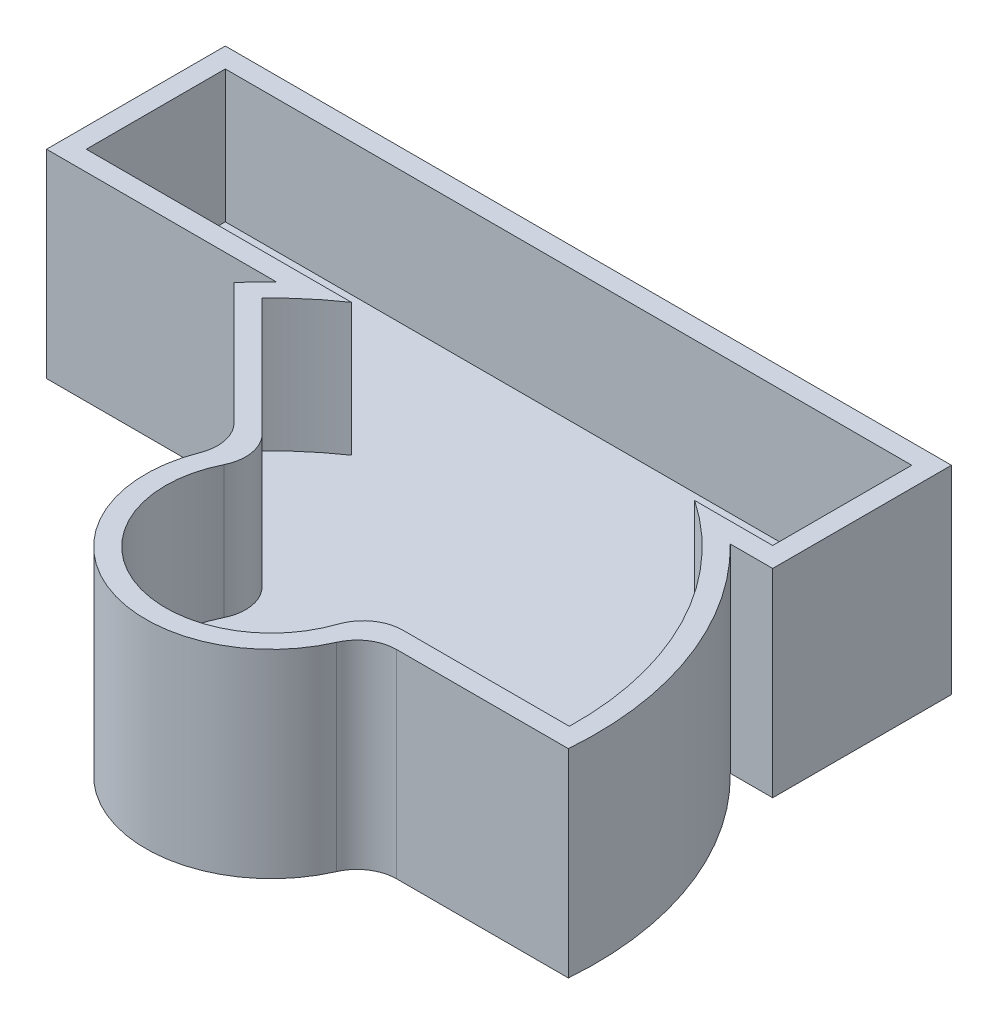
ISO-10303-21;
HEADER;
FILE_DESCRIPTION(('STEP AP214'),'2;1');
FILE_NAME('part.step','',(''),(''),'','','');
FILE_SCHEMA(('AUTOMOTIVE_DESIGN { 1 0 10303 214 1 1 1 1 }'));
ENDSEC;
DATA;
#1=APPLICATION_CONTEXT('core data for automotive mechanical design processes');
#2=APPLICATION_PROTOCOL_DEFINITION('international standard','automotive_design',2000,#1);
#3=PRODUCT_CONTEXT('',#1,'mechanical');
#4=PRODUCT('Part','Part','',(#3));
#5=PRODUCT_RELATED_PRODUCT_CATEGORY('part','',(#4));
#6=PRODUCT_DEFINITION_FORMATION('','',#4);
#7=PRODUCT_DEFINITION_CONTEXT('part definition',#1,'design');
#8=PRODUCT_DEFINITION('design','',#6,#7);
#9=PRODUCT_DEFINITION_SHAPE('','',#8);
#10=(LENGTH_UNIT() NAMED_UNIT(*) SI_UNIT(.MILLI.,.METRE.));
#11=(NAMED_UNIT(*) PLANE_ANGLE_UNIT() SI_UNIT($,.RADIAN.));
#12=(NAMED_UNIT(*) SI_UNIT($,.STERADIAN.) SOLID_ANGLE_UNIT());
#13=UNCERTAINTY_MEASURE_WITH_UNIT(LENGTH_MEASURE(1.E-05),#10,'distance_accuracy_value','');
#14=(GEOMETRIC_REPRESENTATION_CONTEXT(3) GLOBAL_UNCERTAINTY_ASSIGNED_CONTEXT((#13)) GLOBAL_UNIT_ASSIGNED_CONTEXT((#10,
#11,#12)) REPRESENTATION_CONTEXT('',''));
#15=CARTESIAN_POINT('',(0.,0.,0.));
#16=DIRECTION('',(0.,0.,1.));
#17=DIRECTION('',(1.,0.,0.));
#18=AXIS2_PLACEMENT_3D('',#15,#16,#17);
#19=CARTESIAN_POINT('',(-35.,0.,32.5));
#20=DIRECTION('',(0.,1.,0.));
#21=DIRECTION('',(0.,0.,1.));
#22=AXIS2_PLACEMENT_3D('',#19,#20,#21);
#23=PLANE('',#22);
#24=CARTESIAN_POINT('',(0.,0.,17.5));
#25=DIRECTION('',(0.,1.,0.));
#26=DIRECTION('',(0.,0.,1.));
#27=AXIS2_PLACEMENT_3D('',#24,#25,#26);
#28=CIRCLE('',#27,4.);
#29=CARTESIAN_POINT('',(0.,0.,21.5));
#30=VERTEX_POINT('',#29);
#31=EDGE_CURVE('E387',#30,#30,#28,.T.);
#32=ORIENTED_EDGE('',*,*,#31,.T.);
#33=EDGE_LOOP('',(#32));
#34=FACE_BOUND('',#33,.T.);
#35=CARTESIAN_POINT('',(0.,0.,17.5));
#36=DIRECTION('',(0.,1.,0.));
#37=DIRECTION('',(0.,0.,1.));
#38=AXIS2_PLACEMENT_3D('',#35,#36,#37);
#39=CIRCLE('',#38,24.5);
#40=CARTESIAN_POINT('',(-17.1464281994822,0.,0.));
#41=VERTEX_POINT('',#40);
#42=CARTESIAN_POINT('',(-18.6805102122051,0.,1.64791691254111));
#43=VERTEX_POINT('',#42);
#44=EDGE_CURVE('E237',#41,#43,#39,.T.);
#45=ORIENTED_EDGE('',*,*,#44,.F.);
#46=DIRECTION('',(1.,0.,0.));
#47=VECTOR('',#46,1.);
#48=CARTESIAN_POINT('',(-35.,0.,0.));
#49=LINE('',#48,#47);
#50=CARTESIAN_POINT('',(-34.4868,0.,0.));
#51=VERTEX_POINT('',#50);
#52=EDGE_CURVE('E234',#51,#41,#49,.T.);
#53=ORIENTED_EDGE('',*,*,#52,.F.);
#54=DIRECTION('',(0.,0.,1.));
#55=VECTOR('',#54,1.);
#56=CARTESIAN_POINT('',(-34.4868,0.,32.5));
#57=LINE('',#56,#55);
#58=CARTESIAN_POINT('',(-34.4868,0.,-13.5));
#59=VERTEX_POINT('',#58);
#60=EDGE_CURVE('E231',#59,#51,#57,.T.);
#61=ORIENTED_EDGE('',*,*,#60,.F.);
#62=DIRECTION('',(-1.,0.,0.));
#63=VECTOR('',#62,1.);
#64=CARTESIAN_POINT('',(-35.,0.,-13.5));
#65=LINE('',#64,#63);
#66=CARTESIAN_POINT('',(20.3496,0.,-13.5));
#67=VERTEX_POINT('',#66);
#68=EDGE_CURVE('E228',#67,#59,#65,.T.);
#69=ORIENTED_EDGE('',*,*,#68,.F.);
#70=DIRECTION('',(0.,0.,-1.));
#71=VECTOR('',#70,1.);
#72=CARTESIAN_POINT('',(20.3496,0.,32.5));
#73=LINE('',#72,#71);
#74=CARTESIAN_POINT('',(20.3496,0.,0.));
#75=VERTEX_POINT('',#74);
#76=EDGE_CURVE('E222',#75,#67,#73,.T.);
#77=ORIENTED_EDGE('',*,*,#76,.F.);
#78=DIRECTION('',(1.,0.,0.));
#79=VECTOR('',#78,1.);
#80=CARTESIAN_POINT('',(-35.,0.,0.));
#81=LINE('',#80,#79);
#82=CARTESIAN_POINT('',(17.1464281994822,0.,0.));
#83=VERTEX_POINT('',#82);
#84=EDGE_CURVE('E220',#83,#75,#81,.T.);
#85=ORIENTED_EDGE('',*,*,#84,.F.);
#86=CARTESIAN_POINT('',(0.,0.,17.5));
#87=DIRECTION('',(0.,1.,0.));
#88=DIRECTION('',(0.,0.,1.));
#89=AXIS2_PLACEMENT_3D('',#86,#87,#88);
#90=CIRCLE('',#89,24.5);
#91=CARTESIAN_POINT('',(24.4182308941496,0.,19.5));
#92=VERTEX_POINT('',#91);
#93=EDGE_CURVE('E205',#92,#83,#90,.T.);
#94=ORIENTED_EDGE('',*,*,#93,.F.);
#95=DIRECTION('',(1.,0.,0.));
#96=VECTOR('',#95,1.);
#97=CARTESIAN_POINT('',(-35.,0.,19.5));
#98=LINE('',#97,#96);
#99=CARTESIAN_POINT('',(11.4564392373896,0.,19.5));
#100=VERTEX_POINT('',#99);
#101=EDGE_CURVE('E195',#100,#92,#98,.T.);
#102=ORIENTED_EDGE('',*,*,#101,.F.);
#103=CARTESIAN_POINT('',(11.4564392373896,0.,22.5));
#104=DIRECTION('',(0.,1.,0.));
#105=DIRECTION('',(0.,0.,1.));
#106=AXIS2_PLACEMENT_3D('',#103,#104,#105);
#107=CIRCLE('',#106,3.);
#108=CARTESIAN_POINT('',(8.7068938204161,0.,21.3));
#109=VERTEX_POINT('',#108);
#110=EDGE_CURVE('E260',#100,#109,#107,.T.);
#111=ORIENTED_EDGE('',*,*,#110,.T.);
#112=CARTESIAN_POINT('',(0.,0.,17.5));
#113=DIRECTION('',(0.,1.,0.));
#114=DIRECTION('',(0.,0.,1.));
#115=AXIS2_PLACEMENT_3D('',#112,#113,#114);
#116=CIRCLE('',#115,9.5);
#117=CARTESIAN_POINT('',(-8.84370943199635,0.,14.0303021050214));
#118=VERTEX_POINT('',#117);
#119=EDGE_CURVE('E206',#118,#109,#116,.T.);
#120=ORIENTED_EDGE('',*,*,#119,.F.);
#121=CARTESIAN_POINT('',(-11.6364597789426,0.,12.9346080329229));
#122=DIRECTION('',(0.,1.,0.));
#123=DIRECTION('',(0.,0.,1.));
#124=AXIS2_PLACEMENT_3D('',#121,#122,#123);
#125=CIRCLE('',#124,3.);
#126=CARTESIAN_POINT('',(-9.51513943538292,0.,10.8132876893633));
#127=VERTEX_POINT('',#126);
#128=EDGE_CURVE('E264',#118,#127,#125,.T.);
#129=ORIENTED_EDGE('',*,*,#128,.T.);
#130=DIRECTION('',(0.707106781186548,0.,0.707106781186547));
#131=VECTOR('',#130,1.);
#132=CARTESIAN_POINT('',(-11.4142135623731,0.,8.9142135623731));
#133=LINE('',#132,#131);
#134=EDGE_CURVE('E390',#43,#127,#133,.T.);
#135=ORIENTED_EDGE('',*,*,#134,.F.);
#136=EDGE_LOOP('',(#45,#53,#61,#69,#77,#85,#94,#102,#111,#120,#129,#135));
#137=FACE_BOUND('',#136,.T.);
#138=ADVANCED_FACE('F32',(#34,#137),#23,.F.);
#139=CARTESIAN_POINT('',(-35.,5.,32.5));
#140=DIRECTION('',(0.,1.,0.));
#141=DIRECTION('',(0.,0.,1.));
#142=AXIS2_PLACEMENT_3D('',#139,#140,#141);
#143=PLANE('',#142);
#144=DIRECTION('',(0.,0.,1.));
#145=VECTOR('',#144,1.);
#146=CARTESIAN_POINT('',(-32.9868,5.,-12.));
#147=LINE('',#146,#145);
#148=CARTESIAN_POINT('',(-32.9868,5.,-12.));
#149=VERTEX_POINT('',#148);
#150=CARTESIAN_POINT('',(-32.9868,5.,-1.49999999999999));
#151=VERTEX_POINT('',#150);
#152=EDGE_CURVE('E313',#149,#151,#147,.T.);
#153=ORIENTED_EDGE('',*,*,#152,.T.);
#154=DIRECTION('',(1.,0.,0.));
#155=VECTOR('',#154,1.);
#156=CARTESIAN_POINT('',(-32.9868,5.,-1.49999999999999));
#157=LINE('',#156,#155);
#158=CARTESIAN_POINT('',(-12.9614813968157,5.,-1.49999999999999));
#159=VERTEX_POINT('',#158);
#160=EDGE_CURVE('E315',#151,#159,#157,.T.);
#161=ORIENTED_EDGE('',*,*,#160,.T.);
#162=CARTESIAN_POINT('',(0.,5.,17.5));
#163=DIRECTION('',(0.,1.,0.));
#164=DIRECTION('',(0.,0.,1.));
#165=AXIS2_PLACEMENT_3D('',#162,#163,#164);
#166=CIRCLE('',#165,23.);
#167=CARTESIAN_POINT('',(-16.6131659321024,5.,1.5939408490842));
#168=VERTEX_POINT('',#167);
#169=EDGE_CURVE('E317',#159,#168,#166,.T.);
#170=ORIENTED_EDGE('',*,*,#169,.T.);
#171=DIRECTION('',(0.707106781186547,0.,0.707106781186548));
#172=VECTOR('',#171,1.);
#173=CARTESIAN_POINT('',(-5.99934828591139,5.,12.2077584952752));
#174=LINE('',#173,#172);
#175=CARTESIAN_POINT('',(-7.72749399246959,5.,10.479612788717));
#176=VERTEX_POINT('',#175);
#177=EDGE_CURVE('E319',#168,#176,#174,.T.);
#178=ORIENTED_EDGE('',*,*,#177,.T.);
#179=CARTESIAN_POINT('',(-9.84881433602923,5.,12.6009331322766));
#180=DIRECTION('',(0.,1.,0.));
#181=DIRECTION('',(0.,0.,1.));
#182=AXIS2_PLACEMENT_3D('',#179,#180,#181);
#183=CIRCLE('',#182,3.);
#184=CARTESIAN_POINT('',(-7.16277406256671,5.,13.9370422780194));
#185=VERTEX_POINT('',#184);
#186=EDGE_CURVE('E12',#176,#185,#183,.F.);
#187=ORIENTED_EDGE('',*,*,#186,.T.);
#188=CARTESIAN_POINT('',(0.,5.,17.5));
#189=DIRECTION('',(0.,1.,0.));
#190=DIRECTION('',(0.,0.,1.));
#191=AXIS2_PLACEMENT_3D('',#188,#189,#190);
#192=CIRCLE('',#191,8.);
#193=CARTESIAN_POINT('',(7.58423767804153,5.,20.0454545454546));
#194=VERTEX_POINT('',#193);
#195=EDGE_CURVE('E275',#185,#194,#192,.T.);
#196=ORIENTED_EDGE('',*,*,#195,.T.);
#197=CARTESIAN_POINT('',(10.4283268073071,5.,21.));
#198=DIRECTION('',(0.,1.,0.));
#199=DIRECTION('',(0.,0.,1.));
#200=AXIS2_PLACEMENT_3D('',#197,#198,#199);
#201=CIRCLE('',#200,3.);
#202=CARTESIAN_POINT('',(10.4283268073071,5.,18.));
#203=VERTEX_POINT('',#202);
#204=EDGE_CURVE('E40',#194,#203,#201,.F.);
#205=ORIENTED_EDGE('',*,*,#204,.T.);
#206=DIRECTION('',(1.,0.,0.));
#207=VECTOR('',#206,1.);
#208=CARTESIAN_POINT('',(7.98435971133566,5.,18.));
#209=LINE('',#208,#207);
#210=CARTESIAN_POINT('',(22.9945645751338,5.,18.));
#211=VERTEX_POINT('',#210);
#212=EDGE_CURVE('E272',#203,#211,#209,.T.);
#213=ORIENTED_EDGE('',*,*,#212,.T.);
#214=CARTESIAN_POINT('',(0.,5.,17.5));
#215=DIRECTION('',(0.,1.,0.));
#216=DIRECTION('',(0.,0.,1.));
#217=AXIS2_PLACEMENT_3D('',#214,#215,#216);
#218=CIRCLE('',#217,23.);
#219=CARTESIAN_POINT('',(12.9614813968157,5.,-1.49999999999999));
#220=VERTEX_POINT('',#219);
#221=EDGE_CURVE('E285',#211,#220,#218,.T.);
#222=ORIENTED_EDGE('',*,*,#221,.T.);
#223=DIRECTION('',(1.,0.,0.));
#224=VECTOR('',#223,1.);
#225=CARTESIAN_POINT('',(12.9614813968157,5.,-1.49999999999999));
#226=LINE('',#225,#224);
#227=CARTESIAN_POINT('',(18.8496,5.,-1.49999999999999));
#228=VERTEX_POINT('',#227);
#229=EDGE_CURVE('E324',#220,#228,#226,.T.);
#230=ORIENTED_EDGE('',*,*,#229,.T.);
#231=DIRECTION('',(0.,0.,-1.));
#232=VECTOR('',#231,1.);
#233=CARTESIAN_POINT('',(18.8496,5.,-12.));
#234=LINE('',#233,#232);
#235=CARTESIAN_POINT('',(18.8496,5.,-12.));
#236=VERTEX_POINT('',#235);
#237=EDGE_CURVE('E326',#228,#236,#234,.T.);
#238=ORIENTED_EDGE('',*,*,#237,.T.);
#239=DIRECTION('',(-1.,0.,0.));
#240=VECTOR('',#239,1.);
#241=CARTESIAN_POINT('',(-32.9868,5.,-12.));
#242=LINE('',#241,#240);
#243=EDGE_CURVE('E328',#236,#149,#242,.T.);
#244=ORIENTED_EDGE('',*,*,#243,.T.);
#245=EDGE_LOOP('',(#153,#161,#170,#178,#187,#196,#205,#213,#222,#230,#238,#244));
#246=FACE_BOUND('',#245,.T.);
#247=CARTESIAN_POINT('',(0.,5.,17.5));
#248=DIRECTION('',(0.,1.,0.));
#249=DIRECTION('',(0.,0.,1.));
#250=AXIS2_PLACEMENT_3D('',#247,#248,#249);
#251=CIRCLE('',#250,4.);
#252=CARTESIAN_POINT('',(0.,5.,21.5));
#253=VERTEX_POINT('',#252);
#254=EDGE_CURVE('E386',#253,#253,#251,.T.);
#255=ORIENTED_EDGE('',*,*,#254,.F.);
#256=EDGE_LOOP('',(#255));
#257=FACE_BOUND('',#256,.T.);
#258=ADVANCED_FACE('F270',(#246,#257),#143,.T.);
#259=CARTESIAN_POINT('',(0.,0.,17.5));
#260=DIRECTION('',(0.,1.,0.));
#261=DIRECTION('',(0.,0.,1.));
#262=AXIS2_PLACEMENT_3D('',#259,#260,#261);
#263=CYLINDRICAL_SURFACE('',#262,4.);
#264=ORIENTED_EDGE('',*,*,#31,.F.);
#265=EDGE_LOOP('',(#264));
#266=FACE_BOUND('',#265,.T.);
#267=ORIENTED_EDGE('',*,*,#254,.T.);
#268=EDGE_LOOP('',(#267));
#269=FACE_BOUND('',#268,.T.);
#270=ADVANCED_FACE('F453',(#266,#269),#263,.F.);
#271=CARTESIAN_POINT('',(0.,15.,17.5));
#272=DIRECTION('',(0.,1.,0.));
#273=DIRECTION('',(0.,0.,1.));
#274=AXIS2_PLACEMENT_3D('',#271,#272,#273);
#275=PLANE('',#274);
#276=DIRECTION('',(0.,0.,1.));
#277=VECTOR('',#276,1.);
#278=CARTESIAN_POINT('',(-34.4868,15.,-13.5));
#279=LINE('',#278,#277);
#280=CARTESIAN_POINT('',(-34.4868,15.,-13.5));
#281=VERTEX_POINT('',#280);
#282=CARTESIAN_POINT('',(-34.4868,15.,0.));
#283=VERTEX_POINT('',#282);
#284=EDGE_CURVE('E352',#281,#283,#279,.T.);
#285=ORIENTED_EDGE('',*,*,#284,.T.);
#286=DIRECTION('',(1.,0.,0.));
#287=VECTOR('',#286,1.);
#288=CARTESIAN_POINT('',(-34.4868,15.,0.));
#289=LINE('',#288,#287);
#290=CARTESIAN_POINT('',(-17.1464281994822,15.,0.));
#291=VERTEX_POINT('',#290);
#292=EDGE_CURVE('E355',#283,#291,#289,.T.);
#293=ORIENTED_EDGE('',*,*,#292,.T.);
#294=CARTESIAN_POINT('',(0.,15.,17.5));
#295=DIRECTION('',(0.,1.,0.));
#296=DIRECTION('',(0.,0.,1.));
#297=AXIS2_PLACEMENT_3D('',#294,#295,#296);
#298=CIRCLE('',#297,24.5);
#299=CARTESIAN_POINT('',(-18.6805102122051,15.,1.64791691254111));
#300=VERTEX_POINT('',#299);
#301=EDGE_CURVE('E357',#291,#300,#298,.T.);
#302=ORIENTED_EDGE('',*,*,#301,.T.);
#303=DIRECTION('',(0.707106781186548,0.,0.707106781186547));
#304=VECTOR('',#303,1.);
#305=CARTESIAN_POINT('',(-7.98117633065495,15.,12.3472507940913));
#306=LINE('',#305,#304);
#307=CARTESIAN_POINT('',(-9.51513943538292,15.,10.8132876893633));
#308=VERTEX_POINT('',#307);
#309=EDGE_CURVE('E359',#300,#308,#306,.T.);
#310=ORIENTED_EDGE('',*,*,#309,.T.);
#311=CARTESIAN_POINT('',(-11.6364597789426,15.,12.9346080329229));
#312=DIRECTION('',(0.,1.,0.));
#313=DIRECTION('',(0.,0.,1.));
#314=AXIS2_PLACEMENT_3D('',#311,#312,#313);
#315=CIRCLE('',#314,3.);
#316=CARTESIAN_POINT('',(-8.84370943199635,15.,14.0303021050214));
#317=VERTEX_POINT('',#316);
#318=EDGE_CURVE('E266',#308,#317,#315,.F.);
#319=ORIENTED_EDGE('',*,*,#318,.T.);
#320=CARTESIAN_POINT('',(0.,15.,17.5));
#321=DIRECTION('',(0.,1.,0.));
#322=DIRECTION('',(0.,0.,1.));
#323=AXIS2_PLACEMENT_3D('',#320,#321,#322);
#324=CIRCLE('',#323,9.5);
#325=CARTESIAN_POINT('',(8.7068938204161,15.,21.3));
#326=VERTEX_POINT('',#325);
#327=EDGE_CURVE('E362',#317,#326,#324,.T.);
#328=ORIENTED_EDGE('',*,*,#327,.T.);
#329=CARTESIAN_POINT('',(11.4564392373896,15.,22.5));
#330=DIRECTION('',(0.,1.,0.));
#331=DIRECTION('',(0.,0.,1.));
#332=AXIS2_PLACEMENT_3D('',#329,#330,#331);
#333=CIRCLE('',#332,3.);
#334=CARTESIAN_POINT('',(11.4564392373896,15.,19.5));
#335=VERTEX_POINT('',#334);
#336=EDGE_CURVE('E262',#326,#335,#333,.F.);
#337=ORIENTED_EDGE('',*,*,#336,.T.);
#338=DIRECTION('',(1.,0.,0.));
#339=VECTOR('',#338,1.);
#340=CARTESIAN_POINT('',(9.28708781050336,15.,19.5));
#341=LINE('',#340,#339);
#342=CARTESIAN_POINT('',(24.4182308941496,15.,19.5));
#343=VERTEX_POINT('',#342);
#344=EDGE_CURVE('E365',#335,#343,#341,.T.);
#345=ORIENTED_EDGE('',*,*,#344,.T.);
#346=CARTESIAN_POINT('',(0.,15.,17.5));
#347=DIRECTION('',(0.,1.,0.));
#348=DIRECTION('',(0.,0.,1.));
#349=AXIS2_PLACEMENT_3D('',#346,#347,#348);
#350=CIRCLE('',#349,24.5);
#351=CARTESIAN_POINT('',(17.1464281994822,15.,0.));
#352=VERTEX_POINT('',#351);
#353=EDGE_CURVE('E213',#343,#352,#350,.T.);
#354=ORIENTED_EDGE('',*,*,#353,.T.);
#355=DIRECTION('',(1.,0.,0.));
#356=VECTOR('',#355,1.);
#357=CARTESIAN_POINT('',(17.1464281994822,15.,0.));
#358=LINE('',#357,#356);
#359=CARTESIAN_POINT('',(20.3496,15.,0.));
#360=VERTEX_POINT('',#359);
#361=EDGE_CURVE('E368',#352,#360,#358,.T.);
#362=ORIENTED_EDGE('',*,*,#361,.T.);
#363=DIRECTION('',(0.,0.,-1.));
#364=VECTOR('',#363,1.);
#365=CARTESIAN_POINT('',(20.3496,15.,-13.5));
#366=LINE('',#365,#364);
#367=CARTESIAN_POINT('',(20.3496,15.,-13.5));
#368=VERTEX_POINT('',#367);
#369=EDGE_CURVE('E370',#360,#368,#366,.T.);
#370=ORIENTED_EDGE('',*,*,#369,.T.);
#371=DIRECTION('',(-1.,0.,0.));
#372=VECTOR('',#371,1.);
#373=CARTESIAN_POINT('',(-34.4868,15.,-13.5));
#374=LINE('',#373,#372);
#375=EDGE_CURVE('E372',#368,#281,#374,.T.);
#376=ORIENTED_EDGE('',*,*,#375,.T.);
#377=EDGE_LOOP('',(#285,#293,#302,#310,#319,#328,#337,#345,#354,#362,#370,#376));
#378=FACE_BOUND('',#377,.T.);
#379=DIRECTION('',(1.,0.,0.));
#380=VECTOR('',#379,1.);
#381=CARTESIAN_POINT('',(7.98435971133566,15.,18.));
#382=LINE('',#381,#380);
#383=CARTESIAN_POINT('',(10.4283268073071,15.,18.));
#384=VERTEX_POINT('',#383);
#385=CARTESIAN_POINT('',(22.9945645751338,15.,18.));
#386=VERTEX_POINT('',#385);
#387=EDGE_CURVE('E293',#384,#386,#382,.T.);
#388=ORIENTED_EDGE('',*,*,#387,.F.);
#389=CARTESIAN_POINT('',(10.4283268073071,15.,21.));
#390=DIRECTION('',(0.,1.,0.));
#391=DIRECTION('',(0.,0.,1.));
#392=AXIS2_PLACEMENT_3D('',#389,#390,#391);
#393=CIRCLE('',#392,3.);
#394=CARTESIAN_POINT('',(7.58423767804153,15.,20.0454545454546));
#395=VERTEX_POINT('',#394);
#396=EDGE_CURVE('E256',#384,#395,#393,.T.);
#397=ORIENTED_EDGE('',*,*,#396,.T.);
#398=CARTESIAN_POINT('',(0.,15.,17.5));
#399=DIRECTION('',(0.,1.,0.));
#400=DIRECTION('',(0.,0.,1.));
#401=AXIS2_PLACEMENT_3D('',#398,#399,#400);
#402=CIRCLE('',#401,8.);
#403=CARTESIAN_POINT('',(-7.16277406256671,15.,13.9370422780194));
#404=VERTEX_POINT('',#403);
#405=EDGE_CURVE('E291',#404,#395,#402,.T.);
#406=ORIENTED_EDGE('',*,*,#405,.F.);
#407=CARTESIAN_POINT('',(-9.84881433602923,15.,12.6009331322766));
#408=DIRECTION('',(0.,1.,0.));
#409=DIRECTION('',(0.,0.,1.));
#410=AXIS2_PLACEMENT_3D('',#407,#408,#409);
#411=CIRCLE('',#410,3.);
#412=CARTESIAN_POINT('',(-7.72749399246959,15.,10.479612788717));
#413=VERTEX_POINT('',#412);
#414=EDGE_CURVE('E53',#404,#413,#411,.T.);
#415=ORIENTED_EDGE('',*,*,#414,.T.);
#416=DIRECTION('',(0.707106781186547,0.,0.707106781186548));
#417=VECTOR('',#416,1.);
#418=CARTESIAN_POINT('',(-5.99934828591139,15.,12.2077584952752));
#419=LINE('',#418,#417);
#420=CARTESIAN_POINT('',(-16.6131659321024,15.,1.59394084908419));
#421=VERTEX_POINT('',#420);
#422=EDGE_CURVE('E296',#421,#413,#419,.T.);
#423=ORIENTED_EDGE('',*,*,#422,.F.);
#424=CARTESIAN_POINT('',(0.,15.,17.5));
#425=DIRECTION('',(0.,1.,0.));
#426=DIRECTION('',(0.,0.,1.));
#427=AXIS2_PLACEMENT_3D('',#424,#425,#426);
#428=CIRCLE('',#427,23.);
#429=CARTESIAN_POINT('',(-12.9614813968157,15.,-1.49999999999999));
#430=VERTEX_POINT('',#429);
#431=EDGE_CURVE('E300',#430,#421,#428,.T.);
#432=ORIENTED_EDGE('',*,*,#431,.F.);
#433=DIRECTION('',(1.,0.,0.));
#434=VECTOR('',#433,1.);
#435=CARTESIAN_POINT('',(-32.9868,15.,-1.49999999999999));
#436=LINE('',#435,#434);
#437=CARTESIAN_POINT('',(-32.9868,15.,-1.49999999999999));
#438=VERTEX_POINT('',#437);
#439=EDGE_CURVE('E479',#438,#430,#436,.T.);
#440=ORIENTED_EDGE('',*,*,#439,.F.);
#441=DIRECTION('',(0.,0.,1.));
#442=VECTOR('',#441,1.);
#443=CARTESIAN_POINT('',(-32.9868,15.,-12.));
#444=LINE('',#443,#442);
#445=CARTESIAN_POINT('',(-32.9868,15.,-12.));
#446=VERTEX_POINT('',#445);
#447=EDGE_CURVE('E330',#446,#438,#444,.T.);
#448=ORIENTED_EDGE('',*,*,#447,.F.);
#449=DIRECTION('',(-1.,0.,0.));
#450=VECTOR('',#449,1.);
#451=CARTESIAN_POINT('',(-32.9868,15.,-12.));
#452=LINE('',#451,#450);
#453=CARTESIAN_POINT('',(18.8496,15.,-12.));
#454=VERTEX_POINT('',#453);
#455=EDGE_CURVE('E310',#454,#446,#452,.T.);
#456=ORIENTED_EDGE('',*,*,#455,.F.);
#457=DIRECTION('',(0.,0.,-1.));
#458=VECTOR('',#457,1.);
#459=CARTESIAN_POINT('',(18.8496,15.,-12.));
#460=LINE('',#459,#458);
#461=CARTESIAN_POINT('',(18.8496,15.,-1.49999999999999));
#462=VERTEX_POINT('',#461);
#463=EDGE_CURVE('E307',#462,#454,#460,.T.);
#464=ORIENTED_EDGE('',*,*,#463,.F.);
#465=DIRECTION('',(1.,0.,0.));
#466=VECTOR('',#465,1.);
#467=CARTESIAN_POINT('',(12.9614813968157,15.,-1.49999999999999));
#468=LINE('',#467,#466);
#469=CARTESIAN_POINT('',(12.9614813968157,15.,-1.49999999999999));
#470=VERTEX_POINT('',#469);
#471=EDGE_CURVE('E305',#470,#462,#468,.T.);
#472=ORIENTED_EDGE('',*,*,#471,.F.);
#473=CARTESIAN_POINT('',(0.,15.,17.5));
#474=DIRECTION('',(0.,1.,0.));
#475=DIRECTION('',(0.,0.,1.));
#476=AXIS2_PLACEMENT_3D('',#473,#474,#475);
#477=CIRCLE('',#476,23.);
#478=EDGE_CURVE('E298',#386,#470,#477,.T.);
#479=ORIENTED_EDGE('',*,*,#478,.F.);
#480=EDGE_LOOP('',(#388,#397,#406,#415,#423,#432,#440,#448,#456,#464,#472,#479));
#481=FACE_BOUND('',#480,.T.);
#482=ADVANCED_FACE('F290',(#378,#481),#275,.T.);
#483=CARTESIAN_POINT('',(-34.4868,15.,-13.5));
#484=DIRECTION('',(1.,0.,0.));
#485=DIRECTION('',(0.,0.,-1.));
#486=AXIS2_PLACEMENT_3D('',#483,#484,#485);
#487=PLANE('',#486);
#488=DIRECTION('',(0.,-1.,0.));
#489=VECTOR('',#488,1.);
#490=CARTESIAN_POINT('',(-34.4868,15.,-13.5));
#491=LINE('',#490,#489);
#492=EDGE_CURVE('E374',#281,#59,#491,.T.);
#493=ORIENTED_EDGE('',*,*,#492,.T.);
#494=ORIENTED_EDGE('',*,*,#60,.T.);
#495=DIRECTION('',(0.,-1.,0.));
#496=VECTOR('',#495,1.);
#497=CARTESIAN_POINT('',(-34.4868,15.,0.));
#498=LINE('',#497,#496);
#499=EDGE_CURVE('E384',#283,#51,#498,.T.);
#500=ORIENTED_EDGE('',*,*,#499,.F.);
#501=ORIENTED_EDGE('',*,*,#284,.F.);
#502=EDGE_LOOP('',(#493,#494,#500,#501));
#503=FACE_BOUND('',#502,.T.);
#504=ADVANCED_FACE('F426',(#503),#487,.F.);
#505=CARTESIAN_POINT('',(-34.4868,15.,0.));
#506=DIRECTION('',(0.,0.,-1.));
#507=DIRECTION('',(-1.,0.,0.));
#508=AXIS2_PLACEMENT_3D('',#505,#506,#507);
#509=PLANE('',#508);
#510=ORIENTED_EDGE('',*,*,#499,.T.);
#511=ORIENTED_EDGE('',*,*,#52,.T.);
#512=DIRECTION('',(0.,-1.,0.));
#513=VECTOR('',#512,1.);
#514=CARTESIAN_POINT('',(-17.1464281994822,15.,0.));
#515=LINE('',#514,#513);
#516=EDGE_CURVE('E382',#291,#41,#515,.T.);
#517=ORIENTED_EDGE('',*,*,#516,.F.);
#518=ORIENTED_EDGE('',*,*,#292,.F.);
#519=EDGE_LOOP('',(#510,#511,#517,#518));
#520=FACE_BOUND('',#519,.T.);
#521=ADVANCED_FACE('F422',(#520),#509,.F.);
#522=CARTESIAN_POINT('',(0.,15.,17.5));
#523=DIRECTION('',(0.,-1.,0.));
#524=DIRECTION('',(0.,0.,-1.));
#525=AXIS2_PLACEMENT_3D('',#522,#523,#524);
#526=CYLINDRICAL_SURFACE('',#525,24.5);
#527=ORIENTED_EDGE('',*,*,#516,.T.);
#528=ORIENTED_EDGE('',*,*,#44,.T.);
#529=DIRECTION('',(0.,-1.,0.));
#530=VECTOR('',#529,1.);
#531=CARTESIAN_POINT('',(-18.6805102122051,15.,1.64791691254111));
#532=LINE('',#531,#530);
#533=EDGE_CURVE('E214',#300,#43,#532,.T.);
#534=ORIENTED_EDGE('',*,*,#533,.F.);
#535=ORIENTED_EDGE('',*,*,#301,.F.);
#536=EDGE_LOOP('',(#527,#528,#534,#535));
#537=FACE_BOUND('',#536,.T.);
#538=ADVANCED_FACE('F416',(#537),#526,.T.);
#539=CARTESIAN_POINT('',(-7.98117633065495,15.,12.3472507940913));
#540=DIRECTION('',(0.707106781186547,0.,-0.707106781186548));
#541=DIRECTION('',(-0.707106781186548,0.,-0.707106781186547));
#542=AXIS2_PLACEMENT_3D('',#539,#540,#541);
#543=PLANE('',#542);
#544=ORIENTED_EDGE('',*,*,#134,.T.);
#545=DIRECTION('',(0.,1.,0.));
#546=VECTOR('',#545,1.);
#547=CARTESIAN_POINT('',(-9.51513943538292,15.,10.8132876893633));
#548=LINE('',#547,#546);
#549=EDGE_CURVE('E246',#127,#308,#548,.T.);
#550=ORIENTED_EDGE('',*,*,#549,.T.);
#551=ORIENTED_EDGE('',*,*,#309,.F.);
#552=ORIENTED_EDGE('',*,*,#533,.T.);
#553=EDGE_LOOP('',(#544,#550,#551,#552));
#554=FACE_BOUND('',#553,.T.);
#555=ADVANCED_FACE('F411',(#554),#543,.F.);
#556=CARTESIAN_POINT('',(0.,15.,17.5));
#557=DIRECTION('',(0.,-1.,0.));
#558=DIRECTION('',(0.,0.,-1.));
#559=AXIS2_PLACEMENT_3D('',#556,#557,#558);
#560=CYLINDRICAL_SURFACE('',#559,9.5);
#561=ORIENTED_EDGE('',*,*,#119,.T.);
#562=DIRECTION('',(0.,-1.,0.));
#563=VECTOR('',#562,1.);
#564=CARTESIAN_POINT('',(8.7068938204161,15.,21.3));
#565=LINE('',#564,#563);
#566=EDGE_CURVE('E244',#109,#326,#565,.F.);
#567=ORIENTED_EDGE('',*,*,#566,.T.);
#568=ORIENTED_EDGE('',*,*,#327,.F.);
#569=DIRECTION('',(0.,-1.,0.));
#570=VECTOR('',#569,1.);
#571=CARTESIAN_POINT('',(-8.84370943199635,15.,14.0303021050214));
#572=LINE('',#571,#570);
#573=EDGE_CURVE('E241',#317,#118,#572,.T.);
#574=ORIENTED_EDGE('',*,*,#573,.T.);
#575=EDGE_LOOP('',(#561,#567,#568,#574));
#576=FACE_BOUND('',#575,.T.);
#577=ADVANCED_FACE('F398',(#576),#560,.T.);
#578=CARTESIAN_POINT('',(9.28708781050336,15.,19.5));
#579=DIRECTION('',(0.,0.,-1.));
#580=DIRECTION('',(-1.,0.,0.));
#581=AXIS2_PLACEMENT_3D('',#578,#579,#580);
#582=PLANE('',#581);
#583=ORIENTED_EDGE('',*,*,#344,.F.);
#584=DIRECTION('',(0.,1.,0.));
#585=VECTOR('',#584,1.);
#586=CARTESIAN_POINT('',(11.4564392373896,0.,19.5));
#587=LINE('',#586,#585);
#588=EDGE_CURVE('E202',#335,#100,#587,.F.);
#589=ORIENTED_EDGE('',*,*,#588,.T.);
#590=ORIENTED_EDGE('',*,*,#101,.T.);
#591=DIRECTION('',(0.,-1.,0.));
#592=VECTOR('',#591,1.);
#593=CARTESIAN_POINT('',(24.4182308941496,15.,19.5));
#594=LINE('',#593,#592);
#595=EDGE_CURVE('E199',#343,#92,#594,.T.);
#596=ORIENTED_EDGE('',*,*,#595,.F.);
#597=EDGE_LOOP('',(#583,#589,#590,#596));
#598=FACE_BOUND('',#597,.T.);
#599=ADVANCED_FACE('F198',(#598),#582,.F.);
#600=CARTESIAN_POINT('',(0.,15.,17.5));
#601=DIRECTION('',(0.,-1.,0.));
#602=DIRECTION('',(0.,0.,-1.));
#603=AXIS2_PLACEMENT_3D('',#600,#601,#602);
#604=CYLINDRICAL_SURFACE('',#603,24.5);
#605=ORIENTED_EDGE('',*,*,#595,.T.);
#606=ORIENTED_EDGE('',*,*,#93,.T.);
#607=DIRECTION('',(0.,-1.,0.));
#608=VECTOR('',#607,1.);
#609=CARTESIAN_POINT('',(17.1464281994822,15.,0.));
#610=LINE('',#609,#608);
#611=EDGE_CURVE('E215',#352,#83,#610,.T.);
#612=ORIENTED_EDGE('',*,*,#611,.F.);
#613=ORIENTED_EDGE('',*,*,#353,.F.);
#614=EDGE_LOOP('',(#605,#606,#612,#613));
#615=FACE_BOUND('',#614,.T.);
#616=ADVANCED_FACE('F210',(#615),#604,.T.);
#617=CARTESIAN_POINT('',(17.1464281994822,15.,0.));
#618=DIRECTION('',(0.,0.,-1.));
#619=DIRECTION('',(-1.,0.,0.));
#620=AXIS2_PLACEMENT_3D('',#617,#618,#619);
#621=PLANE('',#620);
#622=ORIENTED_EDGE('',*,*,#611,.T.);
#623=ORIENTED_EDGE('',*,*,#84,.T.);
#624=DIRECTION('',(0.,-1.,0.));
#625=VECTOR('',#624,1.);
#626=CARTESIAN_POINT('',(20.3496,15.,0.));
#627=LINE('',#626,#625);
#628=EDGE_CURVE('E378',#360,#75,#627,.T.);
#629=ORIENTED_EDGE('',*,*,#628,.F.);
#630=ORIENTED_EDGE('',*,*,#361,.F.);
#631=EDGE_LOOP('',(#622,#623,#629,#630));
#632=FACE_BOUND('',#631,.T.);
#633=ADVANCED_FACE('F438',(#632),#621,.F.);
#634=CARTESIAN_POINT('',(20.3496,15.,-13.5));
#635=DIRECTION('',(-1.,0.,0.));
#636=DIRECTION('',(0.,0.,1.));
#637=AXIS2_PLACEMENT_3D('',#634,#635,#636);
#638=PLANE('',#637);
#639=ORIENTED_EDGE('',*,*,#628,.T.);
#640=ORIENTED_EDGE('',*,*,#76,.T.);
#641=DIRECTION('',(0.,-1.,0.));
#642=VECTOR('',#641,1.);
#643=CARTESIAN_POINT('',(20.3496,15.,-13.5));
#644=LINE('',#643,#642);
#645=EDGE_CURVE('E376',#368,#67,#644,.T.);
#646=ORIENTED_EDGE('',*,*,#645,.F.);
#647=ORIENTED_EDGE('',*,*,#369,.F.);
#648=EDGE_LOOP('',(#639,#640,#646,#647));
#649=FACE_BOUND('',#648,.T.);
#650=ADVANCED_FACE('F433',(#649),#638,.F.);
#651=CARTESIAN_POINT('',(-34.4868,15.,-13.5));
#652=DIRECTION('',(0.,0.,1.));
#653=DIRECTION('',(1.,0.,0.));
#654=AXIS2_PLACEMENT_3D('',#651,#652,#653);
#655=PLANE('',#654);
#656=ORIENTED_EDGE('',*,*,#645,.T.);
#657=ORIENTED_EDGE('',*,*,#68,.T.);
#658=ORIENTED_EDGE('',*,*,#492,.F.);
#659=ORIENTED_EDGE('',*,*,#375,.F.);
#660=EDGE_LOOP('',(#656,#657,#658,#659));
#661=FACE_BOUND('',#660,.T.);
#662=ADVANCED_FACE('F430',(#661),#655,.F.);
#663=CARTESIAN_POINT('',(-32.9868,15.,-12.));
#664=DIRECTION('',(1.,0.,0.));
#665=DIRECTION('',(0.,0.,-1.));
#666=AXIS2_PLACEMENT_3D('',#663,#664,#665);
#667=PLANE('',#666);
#668=ORIENTED_EDGE('',*,*,#152,.F.);
#669=DIRECTION('',(0.,-1.,0.));
#670=VECTOR('',#669,1.);
#671=CARTESIAN_POINT('',(-32.9868,15.,-12.));
#672=LINE('',#671,#670);
#673=EDGE_CURVE('E312',#446,#149,#672,.T.);
#674=ORIENTED_EDGE('',*,*,#673,.F.);
#675=ORIENTED_EDGE('',*,*,#447,.T.);
#676=DIRECTION('',(0.,-1.,0.));
#677=VECTOR('',#676,1.);
#678=CARTESIAN_POINT('',(-32.9868,15.,-1.49999999999999));
#679=LINE('',#678,#677);
#680=EDGE_CURVE('E349',#438,#151,#679,.T.);
#681=ORIENTED_EDGE('',*,*,#680,.T.);
#682=EDGE_LOOP('',(#668,#674,#675,#681));
#683=FACE_BOUND('',#682,.T.);
#684=ADVANCED_FACE('F486',(#683),#667,.T.);
#685=CARTESIAN_POINT('',(-32.9868,15.,-1.49999999999999));
#686=DIRECTION('',(0.,0.,-1.));
#687=DIRECTION('',(-1.,0.,0.));
#688=AXIS2_PLACEMENT_3D('',#685,#686,#687);
#689=PLANE('',#688);
#690=ORIENTED_EDGE('',*,*,#160,.F.);
#691=ORIENTED_EDGE('',*,*,#680,.F.);
#692=ORIENTED_EDGE('',*,*,#439,.T.);
#693=DIRECTION('',(0.,-1.,0.));
#694=VECTOR('',#693,1.);
#695=CARTESIAN_POINT('',(-12.9614813968157,15.,-1.49999999999999));
#696=LINE('',#695,#694);
#697=EDGE_CURVE('E346',#430,#159,#696,.T.);
#698=ORIENTED_EDGE('',*,*,#697,.T.);
#699=EDGE_LOOP('',(#690,#691,#692,#698));
#700=FACE_BOUND('',#699,.T.);
#701=ADVANCED_FACE('F489',(#700),#689,.T.);
#702=CARTESIAN_POINT('',(0.,15.,17.5));
#703=DIRECTION('',(0.,-1.,0.));
#704=DIRECTION('',(0.,0.,-1.));
#705=AXIS2_PLACEMENT_3D('',#702,#703,#704);
#706=CYLINDRICAL_SURFACE('',#705,23.);
#707=ORIENTED_EDGE('',*,*,#169,.F.);
#708=ORIENTED_EDGE('',*,*,#697,.F.);
#709=ORIENTED_EDGE('',*,*,#431,.T.);
#710=DIRECTION('',(0.,-1.,0.));
#711=VECTOR('',#710,1.);
#712=CARTESIAN_POINT('',(-16.6131659321024,15.,1.59394084908419));
#713=LINE('',#712,#711);
#714=EDGE_CURVE('E343',#421,#168,#713,.T.);
#715=ORIENTED_EDGE('',*,*,#714,.T.);
#716=EDGE_LOOP('',(#707,#708,#709,#715));
#717=FACE_BOUND('',#716,.T.);
#718=ADVANCED_FACE('F475',(#717),#706,.F.);
#719=CARTESIAN_POINT('',(-5.99934828591139,15.,12.2077584952752));
#720=DIRECTION('',(0.707106781186548,0.,-0.707106781186547));
#721=DIRECTION('',(-0.707106781186547,0.,-0.707106781186548));
#722=AXIS2_PLACEMENT_3D('',#719,#720,#721);
#723=PLANE('',#722);
#724=ORIENTED_EDGE('',*,*,#422,.T.);
#725=DIRECTION('',(0.,-1.,0.));
#726=VECTOR('',#725,1.);
#727=CARTESIAN_POINT('',(-7.72749399246959,15.,10.479612788717));
#728=LINE('',#727,#726);
#729=EDGE_CURVE('E258',#413,#176,#728,.T.);
#730=ORIENTED_EDGE('',*,*,#729,.T.);
#731=ORIENTED_EDGE('',*,*,#177,.F.);
#732=ORIENTED_EDGE('',*,*,#714,.F.);
#733=EDGE_LOOP('',(#724,#730,#731,#732));
#734=FACE_BOUND('',#733,.T.);
#735=ADVANCED_FACE('F469',(#734),#723,.T.);
#736=CARTESIAN_POINT('',(0.,15.,17.5));
#737=DIRECTION('',(0.,-1.,0.));
#738=DIRECTION('',(0.,0.,-1.));
#739=AXIS2_PLACEMENT_3D('',#736,#737,#738);
#740=CYLINDRICAL_SURFACE('',#739,8.);
#741=ORIENTED_EDGE('',*,*,#405,.T.);
#742=DIRECTION('',(0.,-1.,0.));
#743=VECTOR('',#742,1.);
#744=CARTESIAN_POINT('',(7.58423767804154,15.,20.0454545454546));
#745=LINE('',#744,#743);
#746=EDGE_CURVE('E250',#395,#194,#745,.T.);
#747=ORIENTED_EDGE('',*,*,#746,.T.);
#748=ORIENTED_EDGE('',*,*,#195,.F.);
#749=DIRECTION('',(0.,-1.,0.));
#750=VECTOR('',#749,1.);
#751=CARTESIAN_POINT('',(-7.16277406256671,15.,13.9370422780194));
#752=LINE('',#751,#750);
#753=EDGE_CURVE('E248',#185,#404,#752,.F.);
#754=ORIENTED_EDGE('',*,*,#753,.T.);
#755=EDGE_LOOP('',(#741,#747,#748,#754));
#756=FACE_BOUND('',#755,.T.);
#757=ADVANCED_FACE('F295',(#756),#740,.F.);
#758=CARTESIAN_POINT('',(7.98435971133566,15.,18.));
#759=DIRECTION('',(0.,0.,-1.));
#760=DIRECTION('',(-1.,0.,0.));
#761=AXIS2_PLACEMENT_3D('',#758,#759,#760);
#762=PLANE('',#761);
#763=ORIENTED_EDGE('',*,*,#212,.F.);
#764=DIRECTION('',(0.,-1.,0.));
#765=VECTOR('',#764,1.);
#766=CARTESIAN_POINT('',(10.4283268073071,15.,18.));
#767=LINE('',#766,#765);
#768=EDGE_CURVE('E253',#203,#384,#767,.F.);
#769=ORIENTED_EDGE('',*,*,#768,.T.);
#770=ORIENTED_EDGE('',*,*,#387,.T.);
#771=DIRECTION('',(0.,-1.,0.));
#772=VECTOR('',#771,1.);
#773=CARTESIAN_POINT('',(22.9945645751338,15.,18.));
#774=LINE('',#773,#772);
#775=EDGE_CURVE('E283',#386,#211,#774,.T.);
#776=ORIENTED_EDGE('',*,*,#775,.T.);
#777=EDGE_LOOP('',(#763,#769,#770,#776));
#778=FACE_BOUND('',#777,.T.);
#779=ADVANCED_FACE('F280',(#778),#762,.T.);
#780=CARTESIAN_POINT('',(0.,15.,17.5));
#781=DIRECTION('',(0.,-1.,0.));
#782=DIRECTION('',(0.,0.,-1.));
#783=AXIS2_PLACEMENT_3D('',#780,#781,#782);
#784=CYLINDRICAL_SURFACE('',#783,23.);
#785=ORIENTED_EDGE('',*,*,#221,.F.);
#786=ORIENTED_EDGE('',*,*,#775,.F.);
#787=ORIENTED_EDGE('',*,*,#478,.T.);
#788=DIRECTION('',(0.,-1.,0.));
#789=VECTOR('',#788,1.);
#790=CARTESIAN_POINT('',(12.9614813968157,15.,-1.49999999999999));
#791=LINE('',#790,#789);
#792=EDGE_CURVE('E339',#470,#220,#791,.T.);
#793=ORIENTED_EDGE('',*,*,#792,.T.);
#794=EDGE_LOOP('',(#785,#786,#787,#793));
#795=FACE_BOUND('',#794,.T.);
#796=ADVANCED_FACE('F533',(#795),#784,.F.);
#797=CARTESIAN_POINT('',(12.9614813968157,15.,-1.49999999999999));
#798=DIRECTION('',(0.,0.,-1.));
#799=DIRECTION('',(-1.,0.,0.));
#800=AXIS2_PLACEMENT_3D('',#797,#798,#799);
#801=PLANE('',#800);
#802=ORIENTED_EDGE('',*,*,#229,.F.);
#803=ORIENTED_EDGE('',*,*,#792,.F.);
#804=ORIENTED_EDGE('',*,*,#471,.T.);
#805=DIRECTION('',(0.,-1.,0.));
#806=VECTOR('',#805,1.);
#807=CARTESIAN_POINT('',(18.8496,15.,-1.49999999999999));
#808=LINE('',#807,#806);
#809=EDGE_CURVE('E336',#462,#228,#808,.T.);
#810=ORIENTED_EDGE('',*,*,#809,.T.);
#811=EDGE_LOOP('',(#802,#803,#804,#810));
#812=FACE_BOUND('',#811,.T.);
#813=ADVANCED_FACE('F538',(#812),#801,.T.);
#814=CARTESIAN_POINT('',(18.8496,15.,-12.));
#815=DIRECTION('',(-1.,0.,0.));
#816=DIRECTION('',(0.,0.,1.));
#817=AXIS2_PLACEMENT_3D('',#814,#815,#816);
#818=PLANE('',#817);
#819=ORIENTED_EDGE('',*,*,#237,.F.);
#820=ORIENTED_EDGE('',*,*,#809,.F.);
#821=ORIENTED_EDGE('',*,*,#463,.T.);
#822=DIRECTION('',(0.,-1.,0.));
#823=VECTOR('',#822,1.);
#824=CARTESIAN_POINT('',(18.8496,15.,-12.));
#825=LINE('',#824,#823);
#826=EDGE_CURVE('E333',#454,#236,#825,.T.);
#827=ORIENTED_EDGE('',*,*,#826,.T.);
#828=EDGE_LOOP('',(#819,#820,#821,#827));
#829=FACE_BOUND('',#828,.T.);
#830=ADVANCED_FACE('F550',(#829),#818,.T.);
#831=CARTESIAN_POINT('',(-32.9868,15.,-12.));
#832=DIRECTION('',(0.,0.,1.));
#833=DIRECTION('',(1.,0.,0.));
#834=AXIS2_PLACEMENT_3D('',#831,#832,#833);
#835=PLANE('',#834);
#836=ORIENTED_EDGE('',*,*,#243,.F.);
#837=ORIENTED_EDGE('',*,*,#826,.F.);
#838=ORIENTED_EDGE('',*,*,#455,.T.);
#839=ORIENTED_EDGE('',*,*,#673,.T.);
#840=EDGE_LOOP('',(#836,#837,#838,#839));
#841=FACE_BOUND('',#840,.T.);
#842=ADVANCED_FACE('F459',(#841),#835,.T.);
#843=CARTESIAN_POINT('',(11.4564392373896,15.,22.5));
#844=DIRECTION('',(0.,-1.,0.));
#845=DIRECTION('',(0.,0.,-1.));
#846=AXIS2_PLACEMENT_3D('',#843,#844,#845);
#847=CYLINDRICAL_SURFACE('',#846,3.);
#848=ORIENTED_EDGE('',*,*,#336,.F.);
#849=ORIENTED_EDGE('',*,*,#566,.F.);
#850=ORIENTED_EDGE('',*,*,#110,.F.);
#851=ORIENTED_EDGE('',*,*,#588,.F.);
#852=EDGE_LOOP('',(#848,#849,#850,#851));
#853=FACE_BOUND('',#852,.T.);
#854=ADVANCED_FACE('F403',(#853),#847,.F.);
#855=CARTESIAN_POINT('',(-11.6364597789426,15.,12.9346080329229));
#856=DIRECTION('',(0.,-1.,0.));
#857=DIRECTION('',(0.,0.,-1.));
#858=AXIS2_PLACEMENT_3D('',#855,#856,#857);
#859=CYLINDRICAL_SURFACE('',#858,3.);
#860=ORIENTED_EDGE('',*,*,#318,.F.);
#861=ORIENTED_EDGE('',*,*,#549,.F.);
#862=ORIENTED_EDGE('',*,*,#128,.F.);
#863=ORIENTED_EDGE('',*,*,#573,.F.);
#864=EDGE_LOOP('',(#860,#861,#862,#863));
#865=FACE_BOUND('',#864,.T.);
#866=ADVANCED_FACE('F407',(#865),#859,.F.);
#867=CARTESIAN_POINT('',(10.4283268073071,15.,21.));
#868=DIRECTION('',(0.,-1.,0.));
#869=DIRECTION('',(0.,0.,-1.));
#870=AXIS2_PLACEMENT_3D('',#867,#868,#869);
#871=CYLINDRICAL_SURFACE('',#870,3.);
#872=ORIENTED_EDGE('',*,*,#396,.F.);
#873=ORIENTED_EDGE('',*,*,#768,.F.);
#874=ORIENTED_EDGE('',*,*,#204,.F.);
#875=ORIENTED_EDGE('',*,*,#746,.F.);
#876=EDGE_LOOP('',(#872,#873,#874,#875));
#877=FACE_BOUND('',#876,.T.);
#878=ADVANCED_FACE('F288',(#877),#871,.T.);
#879=CARTESIAN_POINT('',(-9.84881433602923,15.,12.6009331322766));
#880=DIRECTION('',(0.,-1.,0.));
#881=DIRECTION('',(0.,0.,-1.));
#882=AXIS2_PLACEMENT_3D('',#879,#880,#881);
#883=CYLINDRICAL_SURFACE('',#882,3.);
#884=ORIENTED_EDGE('',*,*,#414,.F.);
#885=ORIENTED_EDGE('',*,*,#753,.F.);
#886=ORIENTED_EDGE('',*,*,#186,.F.);
#887=ORIENTED_EDGE('',*,*,#729,.F.);
#888=EDGE_LOOP('',(#884,#885,#886,#887));
#889=FACE_BOUND('',#888,.T.);
#890=ADVANCED_FACE('F34',(#889),#883,.T.);
#891=CLOSED_SHELL('',(#138,#258,#270,#482,#504,#521,#538,#555,#577,#599,#616,#633,#650,#662,
#684,#701,#718,#735,#757,#779,#796,#813,#830,#842,#854,#866,#878,#890));
#892=MANIFOLD_SOLID_BREP('B2',#891);
#893=ADVANCED_BREP_SHAPE_REPRESENTATION('',(#18,#892),#14);
#894=SHAPE_DEFINITION_REPRESENTATION(#9,#893);
ENDSEC;
END-ISO-10303-21;
